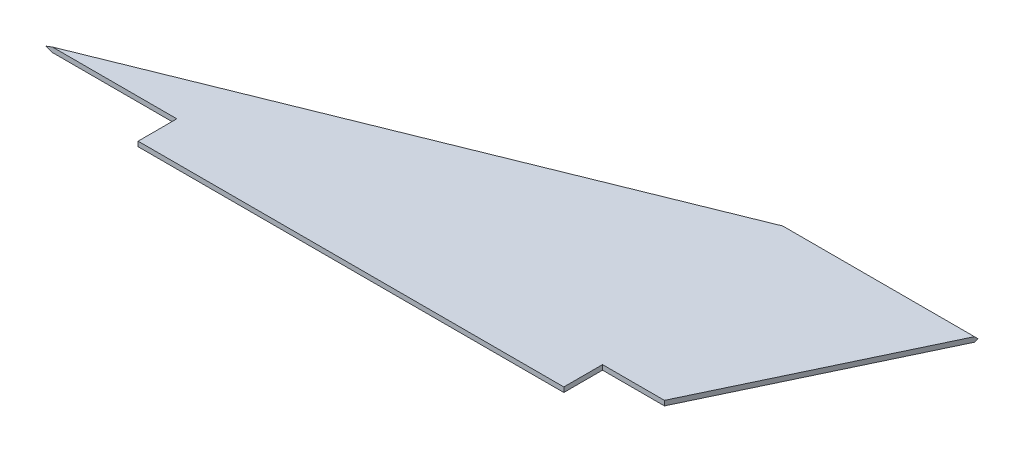
ISO-10303-21;
HEADER;
FILE_DESCRIPTION(('STEP AP214'),'2;1');
FILE_NAME('part.step','',(''),(''),'','','');
FILE_SCHEMA(('AUTOMOTIVE_DESIGN { 1 0 10303 214 1 1 1 1 }'));
ENDSEC;
DATA;
#1=APPLICATION_CONTEXT('core data for automotive mechanical design processes');
#2=APPLICATION_PROTOCOL_DEFINITION('international standard','automotive_design',2000,#1);
#3=PRODUCT_CONTEXT('',#1,'mechanical');
#4=PRODUCT('Part','Part','',(#3));
#5=PRODUCT_RELATED_PRODUCT_CATEGORY('part','',(#4));
#6=PRODUCT_DEFINITION_FORMATION('','',#4);
#7=PRODUCT_DEFINITION_CONTEXT('part definition',#1,'design');
#8=PRODUCT_DEFINITION('design','',#6,#7);
#9=PRODUCT_DEFINITION_SHAPE('','',#8);
#10=(LENGTH_UNIT() NAMED_UNIT(*) SI_UNIT(.MILLI.,.METRE.));
#11=(NAMED_UNIT(*) PLANE_ANGLE_UNIT() SI_UNIT($,.RADIAN.));
#12=(NAMED_UNIT(*) SI_UNIT($,.STERADIAN.) SOLID_ANGLE_UNIT());
#13=UNCERTAINTY_MEASURE_WITH_UNIT(LENGTH_MEASURE(1.E-05),#10,'distance_accuracy_value','');
#14=(GEOMETRIC_REPRESENTATION_CONTEXT(3) GLOBAL_UNCERTAINTY_ASSIGNED_CONTEXT((#13)) GLOBAL_UNIT_ASSIGNED_CONTEXT((#10,
#11,#12)) REPRESENTATION_CONTEXT('',''));
#15=CARTESIAN_POINT('',(0.,0.,0.));
#16=DIRECTION('',(0.,0.,1.));
#17=DIRECTION('',(1.,0.,0.));
#18=AXIS2_PLACEMENT_3D('',#15,#16,#17);
#19=CARTESIAN_POINT('',(0.,3.175,0.));
#20=DIRECTION('',(1.,0.,0.));
#21=DIRECTION('',(0.,0.,-1.));
#22=AXIS2_PLACEMENT_3D('',#19,#20,#21);
#23=PLANE('',#22);
#24=DIRECTION('',(0.,0.,1.));
#25=VECTOR('',#24,1.);
#26=CARTESIAN_POINT('',(0.,0.,0.));
#27=LINE('',#26,#25);
#28=CARTESIAN_POINT('',(0.,0.,-25.4));
#29=VERTEX_POINT('',#28);
#30=CARTESIAN_POINT('',(0.,0.,0.));
#31=VERTEX_POINT('',#30);
#32=EDGE_CURVE('E145',#29,#31,#27,.T.);
#33=ORIENTED_EDGE('',*,*,#32,.T.);
#34=DIRECTION('',(0.,-1.,0.));
#35=VECTOR('',#34,1.);
#36=CARTESIAN_POINT('',(0.,3.175,0.));
#37=LINE('',#36,#35);
#38=CARTESIAN_POINT('',(0.,3.175,0.));
#39=VERTEX_POINT('',#38);
#40=EDGE_CURVE('E123',#39,#31,#37,.T.);
#41=ORIENTED_EDGE('',*,*,#40,.F.);
#42=DIRECTION('',(0.,0.,1.));
#43=VECTOR('',#42,1.);
#44=CARTESIAN_POINT('',(0.,3.175,0.));
#45=LINE('',#44,#43);
#46=CARTESIAN_POINT('',(0.,3.175,-25.4));
#47=VERTEX_POINT('',#46);
#48=EDGE_CURVE('E131',#47,#39,#45,.T.);
#49=ORIENTED_EDGE('',*,*,#48,.F.);
#50=DIRECTION('',(0.,-1.,0.));
#51=VECTOR('',#50,1.);
#52=CARTESIAN_POINT('',(0.,3.175,-25.4));
#53=LINE('',#52,#51);
#54=EDGE_CURVE('E221',#47,#29,#53,.T.);
#55=ORIENTED_EDGE('',*,*,#54,.T.);
#56=EDGE_LOOP('',(#33,#41,#49,#55));
#57=FACE_BOUND('',#56,.T.);
#58=ADVANCED_FACE('F41',(#57),#23,.F.);
#59=CARTESIAN_POINT('',(0.,3.175,0.));
#60=DIRECTION('',(0.,0.,-1.));
#61=DIRECTION('',(-1.,0.,0.));
#62=AXIS2_PLACEMENT_3D('',#59,#60,#61);
#63=PLANE('',#62);
#64=DIRECTION('',(1.,0.,0.));
#65=VECTOR('',#64,1.);
#66=CARTESIAN_POINT('',(0.,0.,0.));
#67=LINE('',#66,#65);
#68=CARTESIAN_POINT('',(279.4,0.,0.));
#69=VERTEX_POINT('',#68);
#70=EDGE_CURVE('E232',#31,#69,#67,.T.);
#71=ORIENTED_EDGE('',*,*,#70,.T.);
#72=DIRECTION('',(0.,-1.,0.));
#73=VECTOR('',#72,1.);
#74=CARTESIAN_POINT('',(279.4,3.175,0.));
#75=LINE('',#74,#73);
#76=CARTESIAN_POINT('',(279.4,3.175,0.));
#77=VERTEX_POINT('',#76);
#78=EDGE_CURVE('E126',#77,#69,#75,.T.);
#79=ORIENTED_EDGE('',*,*,#78,.F.);
#80=DIRECTION('',(1.,0.,0.));
#81=VECTOR('',#80,1.);
#82=CARTESIAN_POINT('',(0.,3.175,0.));
#83=LINE('',#82,#81);
#84=EDGE_CURVE('E119',#39,#77,#83,.T.);
#85=ORIENTED_EDGE('',*,*,#84,.F.);
#86=ORIENTED_EDGE('',*,*,#40,.T.);
#87=EDGE_LOOP('',(#71,#79,#85,#86));
#88=FACE_BOUND('',#87,.T.);
#89=ADVANCED_FACE('F121',(#88),#63,.F.);
#90=CARTESIAN_POINT('',(279.4,3.175,0.));
#91=DIRECTION('',(-1.,0.,0.));
#92=DIRECTION('',(0.,0.,1.));
#93=AXIS2_PLACEMENT_3D('',#90,#91,#92);
#94=PLANE('',#93);
#95=DIRECTION('',(0.,0.,-1.));
#96=VECTOR('',#95,1.);
#97=CARTESIAN_POINT('',(279.4,0.,0.));
#98=LINE('',#97,#96);
#99=CARTESIAN_POINT('',(279.4,0.,-25.4));
#100=VERTEX_POINT('',#99);
#101=EDGE_CURVE('E217',#69,#100,#98,.T.);
#102=ORIENTED_EDGE('',*,*,#101,.T.);
#103=DIRECTION('',(0.,-1.,0.));
#104=VECTOR('',#103,1.);
#105=CARTESIAN_POINT('',(279.4,3.175,-25.4));
#106=LINE('',#105,#104);
#107=CARTESIAN_POINT('',(279.4,3.175,-25.4));
#108=VERTEX_POINT('',#107);
#109=EDGE_CURVE('E153',#108,#100,#106,.T.);
#110=ORIENTED_EDGE('',*,*,#109,.F.);
#111=DIRECTION('',(0.,0.,-1.));
#112=VECTOR('',#111,1.);
#113=CARTESIAN_POINT('',(279.4,3.175,0.));
#114=LINE('',#113,#112);
#115=EDGE_CURVE('E130',#77,#108,#114,.T.);
#116=ORIENTED_EDGE('',*,*,#115,.F.);
#117=ORIENTED_EDGE('',*,*,#78,.T.);
#118=EDGE_LOOP('',(#102,#110,#116,#117));
#119=FACE_BOUND('',#118,.T.);
#120=ADVANCED_FACE('F244',(#119),#94,.F.);
#121=CARTESIAN_POINT('',(279.4,3.175,-25.4));
#122=DIRECTION('',(0.,0.,-1.));
#123=DIRECTION('',(-1.,0.,0.));
#124=AXIS2_PLACEMENT_3D('',#121,#122,#123);
#125=PLANE('',#124);
#126=DIRECTION('',(1.,0.,0.));
#127=VECTOR('',#126,1.);
#128=CARTESIAN_POINT('',(279.4,0.,-25.4));
#129=LINE('',#128,#127);
#130=CARTESIAN_POINT('',(320.04,0.,-25.4));
#131=VERTEX_POINT('',#130);
#132=EDGE_CURVE('E212',#100,#131,#129,.T.);
#133=ORIENTED_EDGE('',*,*,#132,.T.);
#134=DIRECTION('',(0.,-1.,0.));
#135=VECTOR('',#134,1.);
#136=CARTESIAN_POINT('',(320.04,3.175,-25.4));
#137=LINE('',#136,#135);
#138=CARTESIAN_POINT('',(320.04,3.175,-25.4));
#139=VERTEX_POINT('',#138);
#140=EDGE_CURVE('E210',#139,#131,#137,.T.);
#141=ORIENTED_EDGE('',*,*,#140,.F.);
#142=DIRECTION('',(1.,0.,0.));
#143=VECTOR('',#142,1.);
#144=CARTESIAN_POINT('',(279.4,3.175,-25.4));
#145=LINE('',#144,#143);
#146=EDGE_CURVE('E192',#108,#139,#145,.T.);
#147=ORIENTED_EDGE('',*,*,#146,.F.);
#148=ORIENTED_EDGE('',*,*,#109,.T.);
#149=EDGE_LOOP('',(#133,#141,#147,#148));
#150=FACE_BOUND('',#149,.T.);
#151=ADVANCED_FACE('F229',(#150),#125,.F.);
#152=CARTESIAN_POINT('',(386.409633422259,3.175,-165.1));
#153=DIRECTION('',(-0.90324709817353,0.,-0.429120821728679));
#154=DIRECTION('',(-0.429120821728679,0.,0.90324709817353));
#155=AXIS2_PLACEMENT_3D('',#152,#153,#154);
#156=PLANE('',#155);
#157=DIRECTION('',(-0.318448323170978,-0.670294959502752,0.670294959502752));
#158=VECTOR('',#157,1.);
#159=CARTESIAN_POINT('',(373.530647936897,-25.3306968472185,-137.991303152781));
#160=LINE('',#159,#158);
#161=CARTESIAN_POINT('',(385.564928996885,0.,-163.322));
#162=VERTEX_POINT('',#161);
#163=CARTESIAN_POINT('',(386.319129376683,1.58749999999998,-164.9095));
#164=VERTEX_POINT('',#163);
#165=EDGE_CURVE('E66',#162,#164,#160,.F.);
#166=ORIENTED_EDGE('',*,*,#165,.T.);
#167=DIRECTION('',(-0.318448323170978,0.670294959502752,0.670294959502752));
#168=VECTOR('',#167,1.);
#169=CARTESIAN_POINT('',(346.465046129047,85.4754942920935,-81.0215057079064));
#170=LINE('',#169,#168);
#171=CARTESIAN_POINT('',(385.564928996885,3.175,-163.322));
#172=VERTEX_POINT('',#171);
#173=EDGE_CURVE('E178',#164,#172,#170,.T.);
#174=ORIENTED_EDGE('',*,*,#173,.T.);
#175=DIRECTION('',(0.429120821728679,0.,-0.90324709817353));
#176=VECTOR('',#175,1.);
#177=CARTESIAN_POINT('',(386.409633422259,3.175,-165.1));
#178=LINE('',#177,#176);
#179=EDGE_CURVE('E186',#139,#172,#178,.T.);
#180=ORIENTED_EDGE('',*,*,#179,.F.);
#181=ORIENTED_EDGE('',*,*,#140,.T.);
#182=DIRECTION('',(0.429120821728679,0.,-0.90324709817353));
#183=VECTOR('',#182,1.);
#184=CARTESIAN_POINT('',(386.409633422259,0.,-165.1));
#185=LINE('',#184,#183);
#186=EDGE_CURVE('E208',#131,#162,#185,.T.);
#187=ORIENTED_EDGE('',*,*,#186,.T.);
#188=EDGE_LOOP('',(#166,#174,#180,#181,#187));
#189=FACE_BOUND('',#188,.T.);
#190=ADVANCED_FACE('F184',(#189),#156,.F.);
#191=CARTESIAN_POINT('',(0.,3.175,-25.4));
#192=DIRECTION('',(0.,0.,-1.));
#193=DIRECTION('',(-1.,0.,0.));
#194=AXIS2_PLACEMENT_3D('',#191,#192,#193);
#195=PLANE('',#194);
#196=DIRECTION('',(1.,0.,0.));
#197=VECTOR('',#196,1.);
#198=CARTESIAN_POINT('',(0.,3.175,-25.4));
#199=LINE('',#198,#197);
#200=CARTESIAN_POINT('',(-81.6136873849787,3.175,-25.4));
#201=VERTEX_POINT('',#200);
#202=EDGE_CURVE('E137',#201,#47,#199,.T.);
#203=ORIENTED_EDGE('',*,*,#202,.F.);
#204=DIRECTION('',(-0.936450241541365,-0.350800434887301,0.));
#205=VECTOR('',#204,1.);
#206=CARTESIAN_POINT('',(-27.8234128048594,23.325191519364,-25.4));
#207=LINE('',#206,#205);
#208=CARTESIAN_POINT('',(-85.8514665055335,1.58749999999997,-25.4));
#209=VERTEX_POINT('',#208);
#210=EDGE_CURVE('E159',#201,#209,#207,.T.);
#211=ORIENTED_EDGE('',*,*,#210,.T.);
#212=DIRECTION('',(-0.93645024154136,0.350800434887314,0.));
#213=VECTOR('',#212,1.);
#214=CARTESIAN_POINT('',(-86.36,1.77799999999995,-25.4));
#215=LINE('',#214,#213);
#216=CARTESIAN_POINT('',(-81.613687384979,0.,-25.4));
#217=VERTEX_POINT('',#216);
#218=EDGE_CURVE('E151',#209,#217,#215,.F.);
#219=ORIENTED_EDGE('',*,*,#218,.T.);
#220=DIRECTION('',(1.,0.,0.));
#221=VECTOR('',#220,1.);
#222=CARTESIAN_POINT('',(0.,0.,-25.4));
#223=LINE('',#222,#221);
#224=EDGE_CURVE('E142',#217,#29,#223,.T.);
#225=ORIENTED_EDGE('',*,*,#224,.T.);
#226=ORIENTED_EDGE('',*,*,#54,.F.);
#227=EDGE_LOOP('',(#203,#211,#219,#225,#226));
#228=FACE_BOUND('',#227,.T.);
#229=ADVANCED_FACE('F296',(#228),#195,.F.);
#230=CARTESIAN_POINT('',(0.,3.175,0.));
#231=DIRECTION('',(0.,1.,0.));
#232=DIRECTION('',(0.,0.,1.));
#233=AXIS2_PLACEMENT_3D('',#230,#231,#232);
#234=PLANE('',#233);
#235=ORIENTED_EDGE('',*,*,#179,.T.);
#236=DIRECTION('',(-1.,0.,0.));
#237=VECTOR('',#236,1.);
#238=CARTESIAN_POINT('',(264.15594603728,3.175,-163.322));
#239=LINE('',#238,#237);
#240=CARTESIAN_POINT('',(259.755241611906,3.175,-163.322));
#241=VERTEX_POINT('',#240);
#242=EDGE_CURVE('E166',#172,#241,#239,.T.);
#243=ORIENTED_EDGE('',*,*,#242,.T.);
#244=DIRECTION('',(-0.927183854566789,0.,0.37460659341591));
#245=VECTOR('',#244,1.);
#246=CARTESIAN_POINT('',(-85.6939494769065,3.175,-23.7514671065802));
#247=LINE('',#246,#245);
#248=EDGE_CURVE('E147',#241,#201,#247,.T.);
#249=ORIENTED_EDGE('',*,*,#248,.T.);
#250=ORIENTED_EDGE('',*,*,#202,.T.);
#251=ORIENTED_EDGE('',*,*,#48,.T.);
#252=ORIENTED_EDGE('',*,*,#84,.T.);
#253=ORIENTED_EDGE('',*,*,#115,.T.);
#254=ORIENTED_EDGE('',*,*,#146,.T.);
#255=EDGE_LOOP('',(#235,#243,#249,#250,#251,#252,#253,#254));
#256=FACE_BOUND('',#255,.T.);
#257=ADVANCED_FACE('F135',(#256),#234,.T.);
#258=CARTESIAN_POINT('',(0.,0.,0.));
#259=DIRECTION('',(0.,1.,0.));
#260=DIRECTION('',(0.,0.,1.));
#261=AXIS2_PLACEMENT_3D('',#258,#259,#260);
#262=PLANE('',#261);
#263=DIRECTION('',(0.927183854566789,0.,-0.37460659341591));
#264=VECTOR('',#263,1.);
#265=CARTESIAN_POINT('',(-20.2750182031126,0.,-50.1824310073005));
#266=LINE('',#265,#264);
#267=CARTESIAN_POINT('',(259.755241611906,0.,-163.322));
#268=VERTEX_POINT('',#267);
#269=EDGE_CURVE('E163',#217,#268,#266,.T.);
#270=ORIENTED_EDGE('',*,*,#269,.T.);
#271=DIRECTION('',(1.,0.,0.));
#272=VECTOR('',#271,1.);
#273=CARTESIAN_POINT('',(0.,0.,-163.322));
#274=LINE('',#273,#272);
#275=EDGE_CURVE('E11',#268,#162,#274,.T.);
#276=ORIENTED_EDGE('',*,*,#275,.T.);
#277=ORIENTED_EDGE('',*,*,#186,.F.);
#278=ORIENTED_EDGE('',*,*,#132,.F.);
#279=ORIENTED_EDGE('',*,*,#101,.F.);
#280=ORIENTED_EDGE('',*,*,#70,.F.);
#281=ORIENTED_EDGE('',*,*,#32,.F.);
#282=ORIENTED_EDGE('',*,*,#224,.F.);
#283=EDGE_LOOP('',(#270,#276,#277,#278,#279,#280,#281,#282));
#284=FACE_BOUND('',#283,.T.);
#285=ADVANCED_FACE('F206',(#284),#262,.F.);
#286=CARTESIAN_POINT('',(-86.36,1.77799999999995,-25.4));
#287=DIRECTION('',(0.264886862481582,0.707106781186547,0.655617990970858));
#288=DIRECTION('',(-0.927183854566789,0.,0.37460659341591));
#289=AXIS2_PLACEMENT_3D('',#286,#287,#288);
#290=PLANE('',#289);
#291=DIRECTION('',(0.927183854566789,0.,-0.37460659341591));
#292=VECTOR('',#291,1.);
#293=CARTESIAN_POINT('',(-20.8697061701604,1.58749999999997,-51.6543353764253));
#294=LINE('',#293,#292);
#295=CARTESIAN_POINT('',(259.44666287115,1.58749999999998,-164.9095));
#296=VERTEX_POINT('',#295);
#297=EDGE_CURVE('E167',#296,#209,#294,.F.);
#298=ORIENTED_EDGE('',*,*,#297,.F.);
#299=DIRECTION('',(0.136167425368278,-0.70052067502272,0.70052067502272));
#300=VECTOR('',#299,1.);
#301=CARTESIAN_POINT('',(266.324239458582,-33.7945642530202,-129.52743574698));
#302=LINE('',#301,#300);
#303=EDGE_CURVE('E52',#296,#268,#302,.T.);
#304=ORIENTED_EDGE('',*,*,#303,.T.);
#305=ORIENTED_EDGE('',*,*,#269,.F.);
#306=ORIENTED_EDGE('',*,*,#218,.F.);
#307=EDGE_LOOP('',(#298,#304,#305,#306));
#308=FACE_BOUND('',#307,.T.);
#309=ADVANCED_FACE('F201',(#308),#290,.F.);
#310=CARTESIAN_POINT('',(-20.2750182031126,3.175,-50.1824310073004));
#311=DIRECTION('',(-0.264886862481576,0.707106781186563,-0.655617990970844));
#312=DIRECTION('',(0.927183854566789,0.,-0.37460659341591));
#313=AXIS2_PLACEMENT_3D('',#310,#311,#312);
#314=PLANE('',#313);
#315=ORIENTED_EDGE('',*,*,#248,.F.);
#316=DIRECTION('',(-0.136167425368357,-0.700520675022712,-0.700520675022712));
#317=VECTOR('',#316,1.);
#318=CARTESIAN_POINT('',(265.355209734339,31.9843384935542,-134.512661506446));
#319=LINE('',#318,#317);
#320=EDGE_CURVE('E173',#241,#296,#319,.T.);
#321=ORIENTED_EDGE('',*,*,#320,.T.);
#322=ORIENTED_EDGE('',*,*,#297,.T.);
#323=ORIENTED_EDGE('',*,*,#210,.F.);
#324=EDGE_LOOP('',(#315,#321,#322,#323));
#325=FACE_BOUND('',#324,.T.);
#326=ADVANCED_FACE('F198',(#325),#314,.T.);
#327=CARTESIAN_POINT('',(259.409633422259,1.778,-165.1));
#328=DIRECTION('',(0.,0.707106781186547,0.707106781186547));
#329=DIRECTION('',(-1.,0.,0.));
#330=AXIS2_PLACEMENT_3D('',#327,#328,#329);
#331=PLANE('',#330);
#332=DIRECTION('',(1.,0.,0.));
#333=VECTOR('',#332,1.);
#334=CARTESIAN_POINT('',(0.,1.5875,-164.9095));
#335=LINE('',#334,#333);
#336=EDGE_CURVE('E46',#164,#296,#335,.F.);
#337=ORIENTED_EDGE('',*,*,#336,.F.);
#338=ORIENTED_EDGE('',*,*,#165,.F.);
#339=ORIENTED_EDGE('',*,*,#275,.F.);
#340=ORIENTED_EDGE('',*,*,#303,.F.);
#341=EDGE_LOOP('',(#337,#338,#339,#340));
#342=FACE_BOUND('',#341,.T.);
#343=ADVANCED_FACE('F44',(#342),#331,.F.);
#344=CARTESIAN_POINT('',(0.,3.175,-163.322));
#345=DIRECTION('',(0.,0.707106781186547,-0.707106781186547));
#346=DIRECTION('',(1.,0.,0.));
#347=AXIS2_PLACEMENT_3D('',#344,#345,#346);
#348=PLANE('',#347);
#349=ORIENTED_EDGE('',*,*,#173,.F.);
#350=ORIENTED_EDGE('',*,*,#336,.T.);
#351=ORIENTED_EDGE('',*,*,#320,.F.);
#352=ORIENTED_EDGE('',*,*,#242,.F.);
#353=EDGE_LOOP('',(#349,#350,#351,#352));
#354=FACE_BOUND('',#353,.T.);
#355=ADVANCED_FACE('F196',(#354),#348,.T.);
#356=CLOSED_SHELL('',(#58,#89,#120,#151,#190,#229,#257,#285,#309,#326,#343,#355));
#357=MANIFOLD_SOLID_BREP('B2',#356);
#358=ADVANCED_BREP_SHAPE_REPRESENTATION('',(#18,#357),#14);
#359=SHAPE_DEFINITION_REPRESENTATION(#9,#358);
ENDSEC;
END-ISO-10303-21;
